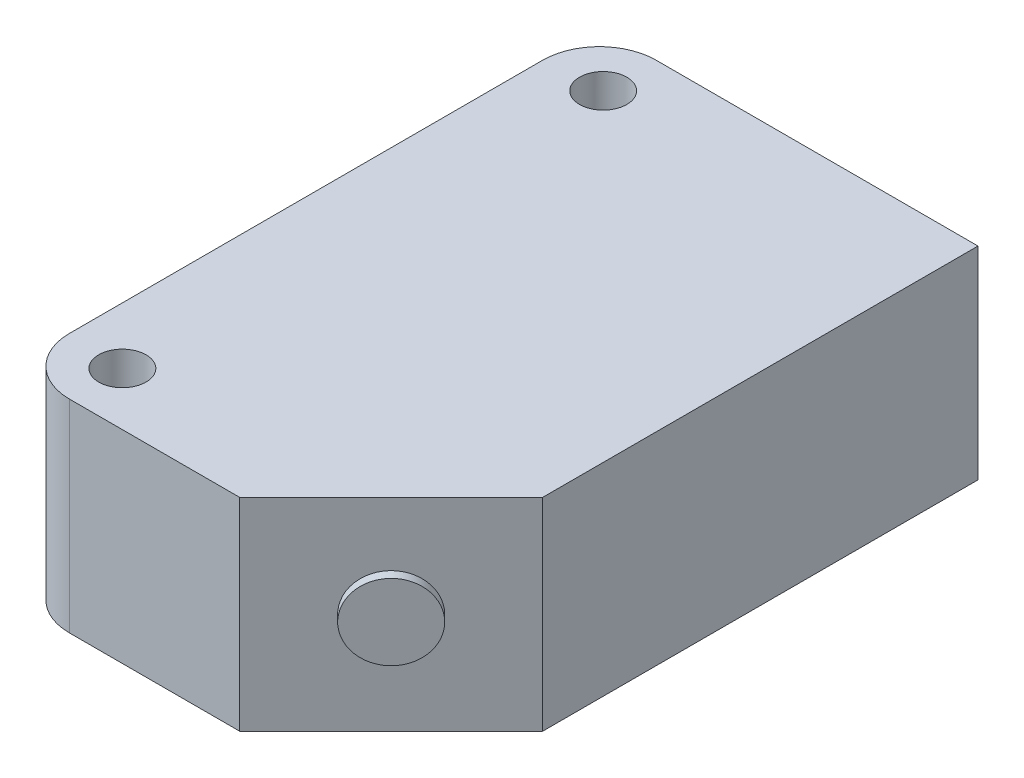
ISO-10303-21;
HEADER;
FILE_DESCRIPTION(('STEP AP214'),'2;1');
FILE_NAME('part.step','',(''),(''),'','','');
FILE_SCHEMA(('AUTOMOTIVE_DESIGN { 1 0 10303 214 1 1 1 1 }'));
ENDSEC;
DATA;
#1=APPLICATION_CONTEXT('core data for automotive mechanical design processes');
#2=APPLICATION_PROTOCOL_DEFINITION('international standard','automotive_design',2000,#1);
#3=PRODUCT_CONTEXT('',#1,'mechanical');
#4=PRODUCT('Part','Part','',(#3));
#5=PRODUCT_RELATED_PRODUCT_CATEGORY('part','',(#4));
#6=PRODUCT_DEFINITION_FORMATION('','',#4);
#7=PRODUCT_DEFINITION_CONTEXT('part definition',#1,'design');
#8=PRODUCT_DEFINITION('design','',#6,#7);
#9=PRODUCT_DEFINITION_SHAPE('','',#8);
#10=(LENGTH_UNIT() NAMED_UNIT(*) SI_UNIT(.MILLI.,.METRE.));
#11=(NAMED_UNIT(*) PLANE_ANGLE_UNIT() SI_UNIT($,.RADIAN.));
#12=(NAMED_UNIT(*) SI_UNIT($,.STERADIAN.) SOLID_ANGLE_UNIT());
#13=UNCERTAINTY_MEASURE_WITH_UNIT(LENGTH_MEASURE(1.E-05),#10,'distance_accuracy_value','');
#14=(GEOMETRIC_REPRESENTATION_CONTEXT(3) GLOBAL_UNCERTAINTY_ASSIGNED_CONTEXT((#13)) GLOBAL_UNIT_ASSIGNED_CONTEXT((#10,
#11,#12)) REPRESENTATION_CONTEXT('',''));
#15=CARTESIAN_POINT('',(0.,0.,0.));
#16=DIRECTION('',(0.,0.,1.));
#17=DIRECTION('',(1.,0.,0.));
#18=AXIS2_PLACEMENT_3D('',#15,#16,#17);
#19=CARTESIAN_POINT('',(-10.,10.7,-15.5));
#20=DIRECTION('',(1.,0.,0.));
#21=DIRECTION('',(0.,0.,-1.));
#22=AXIS2_PLACEMENT_3D('',#19,#20,#21);
#23=PLANE('',#22);
#24=DIRECTION('',(0.,0.,1.));
#25=VECTOR('',#24,1.);
#26=CARTESIAN_POINT('',(-10.,0.,-15.5));
#27=LINE('',#26,#25);
#28=CARTESIAN_POINT('',(-10.,0.,-12.5));
#29=VERTEX_POINT('',#28);
#30=CARTESIAN_POINT('',(-10.,0.,12.5));
#31=VERTEX_POINT('',#30);
#32=EDGE_CURVE('E122',#29,#31,#27,.T.);
#33=ORIENTED_EDGE('',*,*,#32,.T.);
#34=DIRECTION('',(0.,-1.,0.));
#35=VECTOR('',#34,1.);
#36=CARTESIAN_POINT('',(-10.,10.7,12.5));
#37=LINE('',#36,#35);
#38=CARTESIAN_POINT('',(-10.,10.7,12.5));
#39=VERTEX_POINT('',#38);
#40=EDGE_CURVE('E59',#31,#39,#37,.F.);
#41=ORIENTED_EDGE('',*,*,#40,.T.);
#42=DIRECTION('',(0.,0.,1.));
#43=VECTOR('',#42,1.);
#44=CARTESIAN_POINT('',(-10.,10.7,-15.5));
#45=LINE('',#44,#43);
#46=CARTESIAN_POINT('',(-10.,10.7,-12.5));
#47=VERTEX_POINT('',#46);
#48=EDGE_CURVE('E129',#47,#39,#45,.T.);
#49=ORIENTED_EDGE('',*,*,#48,.F.);
#50=DIRECTION('',(0.,-1.,0.));
#51=VECTOR('',#50,1.);
#52=CARTESIAN_POINT('',(-10.,10.7,-12.5));
#53=LINE('',#52,#51);
#54=EDGE_CURVE('E153',#47,#29,#53,.T.);
#55=ORIENTED_EDGE('',*,*,#54,.T.);
#56=EDGE_LOOP('',(#33,#41,#49,#55));
#57=FACE_BOUND('',#56,.T.);
#58=ADVANCED_FACE('F38',(#57),#23,.F.);
#59=CARTESIAN_POINT('',(10.,10.7,15.5));
#60=DIRECTION('',(0.,0.,-1.));
#61=DIRECTION('',(-1.,0.,0.));
#62=AXIS2_PLACEMENT_3D('',#59,#60,#61);
#63=PLANE('',#62);
#64=DIRECTION('',(1.,0.,0.));
#65=VECTOR('',#64,1.);
#66=CARTESIAN_POINT('',(10.,10.7,15.5));
#67=LINE('',#66,#65);
#68=CARTESIAN_POINT('',(-7.,10.7,15.5));
#69=VERTEX_POINT('',#68);
#70=CARTESIAN_POINT('',(1.99999999999998,10.7,15.5));
#71=VERTEX_POINT('',#70);
#72=EDGE_CURVE('E108',#69,#71,#67,.T.);
#73=ORIENTED_EDGE('',*,*,#72,.F.);
#74=DIRECTION('',(0.,-1.,0.));
#75=VECTOR('',#74,1.);
#76=CARTESIAN_POINT('',(-7.,10.7,15.5));
#77=LINE('',#76,#75);
#78=CARTESIAN_POINT('',(-7.,0.,15.5));
#79=VERTEX_POINT('',#78);
#80=EDGE_CURVE('E146',#69,#79,#77,.T.);
#81=ORIENTED_EDGE('',*,*,#80,.T.);
#82=DIRECTION('',(1.,0.,0.));
#83=VECTOR('',#82,1.);
#84=CARTESIAN_POINT('',(10.,0.,15.5));
#85=LINE('',#84,#83);
#86=CARTESIAN_POINT('',(1.99999999999998,0.,15.5));
#87=VERTEX_POINT('',#86);
#88=EDGE_CURVE('E124',#79,#87,#85,.T.);
#89=ORIENTED_EDGE('',*,*,#88,.T.);
#90=DIRECTION('',(0.,1.,0.));
#91=VECTOR('',#90,1.);
#92=CARTESIAN_POINT('',(1.99999999999998,10.7,15.5));
#93=LINE('',#92,#91);
#94=EDGE_CURVE('E141',#87,#71,#93,.T.);
#95=ORIENTED_EDGE('',*,*,#94,.T.);
#96=EDGE_LOOP('',(#73,#81,#89,#95));
#97=FACE_BOUND('',#96,.T.);
#98=ADVANCED_FACE('F163',(#97),#63,.F.);
#99=CARTESIAN_POINT('',(9.99999999999999,10.7,-15.5));
#100=DIRECTION('',(-1.,0.,0.));
#101=DIRECTION('',(0.,0.,1.));
#102=AXIS2_PLACEMENT_3D('',#99,#100,#101);
#103=PLANE('',#102);
#104=DIRECTION('',(0.,0.,-1.));
#105=VECTOR('',#104,1.);
#106=CARTESIAN_POINT('',(9.99999999999999,10.7,-15.5));
#107=LINE('',#106,#105);
#108=CARTESIAN_POINT('',(10.,10.7,7.5));
#109=VERTEX_POINT('',#108);
#110=CARTESIAN_POINT('',(9.99999999999999,10.7,-15.5));
#111=VERTEX_POINT('',#110);
#112=EDGE_CURVE('E98',#109,#111,#107,.T.);
#113=ORIENTED_EDGE('',*,*,#112,.F.);
#114=DIRECTION('',(0.,-1.,0.));
#115=VECTOR('',#114,1.);
#116=CARTESIAN_POINT('',(10.,10.7,7.5));
#117=LINE('',#116,#115);
#118=CARTESIAN_POINT('',(10.,0.,7.5));
#119=VERTEX_POINT('',#118);
#120=EDGE_CURVE('E116',#109,#119,#117,.T.);
#121=ORIENTED_EDGE('',*,*,#120,.T.);
#122=DIRECTION('',(0.,0.,-1.));
#123=VECTOR('',#122,1.);
#124=CARTESIAN_POINT('',(9.99999999999999,0.,-15.5));
#125=LINE('',#124,#123);
#126=CARTESIAN_POINT('',(9.99999999999999,0.,-15.5));
#127=VERTEX_POINT('',#126);
#128=EDGE_CURVE('E114',#119,#127,#125,.T.);
#129=ORIENTED_EDGE('',*,*,#128,.T.);
#130=DIRECTION('',(0.,-1.,0.));
#131=VECTOR('',#130,1.);
#132=CARTESIAN_POINT('',(9.99999999999999,10.7,-15.5));
#133=LINE('',#132,#131);
#134=EDGE_CURVE('E111',#111,#127,#133,.T.);
#135=ORIENTED_EDGE('',*,*,#134,.F.);
#136=EDGE_LOOP('',(#113,#121,#129,#135));
#137=FACE_BOUND('',#136,.T.);
#138=ADVANCED_FACE('F112',(#137),#103,.F.);
#139=CARTESIAN_POINT('',(9.99999999999999,10.7,-15.5));
#140=DIRECTION('',(0.,0.,1.));
#141=DIRECTION('',(1.,0.,0.));
#142=AXIS2_PLACEMENT_3D('',#139,#140,#141);
#143=PLANE('',#142);
#144=DIRECTION('',(-1.,0.,0.));
#145=VECTOR('',#144,1.);
#146=CARTESIAN_POINT('',(9.99999999999999,0.,-15.5));
#147=LINE('',#146,#145);
#148=CARTESIAN_POINT('',(-7.00000000000001,0.,-15.5));
#149=VERTEX_POINT('',#148);
#150=EDGE_CURVE('E128',#127,#149,#147,.T.);
#151=ORIENTED_EDGE('',*,*,#150,.T.);
#152=DIRECTION('',(0.,-1.,0.));
#153=VECTOR('',#152,1.);
#154=CARTESIAN_POINT('',(-7.00000000000001,10.7,-15.5));
#155=LINE('',#154,#153);
#156=CARTESIAN_POINT('',(-7.00000000000001,10.7,-15.5));
#157=VERTEX_POINT('',#156);
#158=EDGE_CURVE('E11',#149,#157,#155,.F.);
#159=ORIENTED_EDGE('',*,*,#158,.T.);
#160=DIRECTION('',(-1.,0.,0.));
#161=VECTOR('',#160,1.);
#162=CARTESIAN_POINT('',(9.99999999999999,10.7,-15.5));
#163=LINE('',#162,#161);
#164=EDGE_CURVE('E101',#111,#157,#163,.T.);
#165=ORIENTED_EDGE('',*,*,#164,.F.);
#166=ORIENTED_EDGE('',*,*,#134,.T.);
#167=EDGE_LOOP('',(#151,#159,#165,#166));
#168=FACE_BOUND('',#167,.T.);
#169=ADVANCED_FACE('F118',(#168),#143,.F.);
#170=CARTESIAN_POINT('',(0.,10.7,0.));
#171=DIRECTION('',(0.,-1.,0.));
#172=DIRECTION('',(0.,0.,-1.));
#173=AXIS2_PLACEMENT_3D('',#170,#171,#172);
#174=PLANE('',#173);
#175=CARTESIAN_POINT('',(-7.,10.7,-12.7));
#176=DIRECTION('',(0.,1.,0.));
#177=DIRECTION('',(0.,0.,1.));
#178=AXIS2_PLACEMENT_3D('',#175,#176,#177);
#179=CIRCLE('',#178,1.25);
#180=CARTESIAN_POINT('',(-7.,10.7,-11.45));
#181=VERTEX_POINT('',#180);
#182=EDGE_CURVE('E134',#181,#181,#179,.T.);
#183=ORIENTED_EDGE('',*,*,#182,.F.);
#184=EDGE_LOOP('',(#183));
#185=FACE_BOUND('',#184,.T.);
#186=CARTESIAN_POINT('',(-7.,10.7,12.7));
#187=DIRECTION('',(0.,1.,0.));
#188=DIRECTION('',(0.,0.,-1.));
#189=AXIS2_PLACEMENT_3D('',#186,#187,#188);
#190=CIRCLE('',#189,1.25);
#191=CARTESIAN_POINT('',(-7.,10.7,11.45));
#192=VERTEX_POINT('',#191);
#193=EDGE_CURVE('E218',#192,#192,#190,.T.);
#194=ORIENTED_EDGE('',*,*,#193,.F.);
#195=EDGE_LOOP('',(#194));
#196=FACE_BOUND('',#195,.T.);
#197=ORIENTED_EDGE('',*,*,#48,.T.);
#198=CARTESIAN_POINT('',(-7.,10.7,12.5));
#199=DIRECTION('',(0.,-1.,0.));
#200=DIRECTION('',(0.,0.,-1.));
#201=AXIS2_PLACEMENT_3D('',#198,#199,#200);
#202=CIRCLE('',#201,3.);
#203=EDGE_CURVE('E46',#39,#69,#202,.F.);
#204=ORIENTED_EDGE('',*,*,#203,.T.);
#205=ORIENTED_EDGE('',*,*,#72,.T.);
#206=DIRECTION('',(-0.707106781186548,0.,0.707106781186547));
#207=VECTOR('',#206,1.);
#208=CARTESIAN_POINT('',(10.,10.7,7.50000000000001));
#209=LINE('',#208,#207);
#210=EDGE_CURVE('E104',#71,#109,#209,.F.);
#211=ORIENTED_EDGE('',*,*,#210,.T.);
#212=ORIENTED_EDGE('',*,*,#112,.T.);
#213=ORIENTED_EDGE('',*,*,#164,.T.);
#214=CARTESIAN_POINT('',(-7.00000000000001,10.7,-12.5));
#215=DIRECTION('',(0.,-1.,0.));
#216=DIRECTION('',(0.,0.,-1.));
#217=AXIS2_PLACEMENT_3D('',#214,#215,#216);
#218=CIRCLE('',#217,3.);
#219=EDGE_CURVE('E157',#157,#47,#218,.F.);
#220=ORIENTED_EDGE('',*,*,#219,.T.);
#221=EDGE_LOOP('',(#197,#204,#205,#211,#212,#213,#220));
#222=FACE_BOUND('',#221,.T.);
#223=ADVANCED_FACE('F100',(#185,#196,#222),#174,.F.);
#224=CARTESIAN_POINT('',(0.,0.,0.));
#225=DIRECTION('',(0.,-1.,0.));
#226=DIRECTION('',(0.,0.,-1.));
#227=AXIS2_PLACEMENT_3D('',#224,#225,#226);
#228=PLANE('',#227);
#229=CARTESIAN_POINT('',(-7.,0.,-12.7));
#230=DIRECTION('',(0.,-1.,0.));
#231=DIRECTION('',(0.,0.,-1.));
#232=AXIS2_PLACEMENT_3D('',#229,#230,#231);
#233=CIRCLE('',#232,1.25);
#234=CARTESIAN_POINT('',(-7.,0.,-13.95));
#235=VERTEX_POINT('',#234);
#236=EDGE_CURVE('E125',#235,#235,#233,.T.);
#237=ORIENTED_EDGE('',*,*,#236,.F.);
#238=EDGE_LOOP('',(#237));
#239=FACE_BOUND('',#238,.T.);
#240=CARTESIAN_POINT('',(-7.,0.,12.7));
#241=DIRECTION('',(0.,-1.,0.));
#242=DIRECTION('',(0.,0.,-1.));
#243=AXIS2_PLACEMENT_3D('',#240,#241,#242);
#244=CIRCLE('',#243,1.25);
#245=CARTESIAN_POINT('',(-7.,0.,11.45));
#246=VERTEX_POINT('',#245);
#247=EDGE_CURVE('E131',#246,#246,#244,.T.);
#248=ORIENTED_EDGE('',*,*,#247,.F.);
#249=EDGE_LOOP('',(#248));
#250=FACE_BOUND('',#249,.T.);
#251=ORIENTED_EDGE('',*,*,#88,.F.);
#252=CARTESIAN_POINT('',(-7.,0.,12.5));
#253=DIRECTION('',(0.,-1.,0.));
#254=DIRECTION('',(0.,0.,-1.));
#255=AXIS2_PLACEMENT_3D('',#252,#253,#254);
#256=CIRCLE('',#255,3.);
#257=EDGE_CURVE('E151',#79,#31,#256,.T.);
#258=ORIENTED_EDGE('',*,*,#257,.T.);
#259=ORIENTED_EDGE('',*,*,#32,.F.);
#260=CARTESIAN_POINT('',(-7.00000000000001,0.,-12.5));
#261=DIRECTION('',(0.,-1.,0.));
#262=DIRECTION('',(0.,0.,-1.));
#263=AXIS2_PLACEMENT_3D('',#260,#261,#262);
#264=CIRCLE('',#263,3.);
#265=EDGE_CURVE('E149',#29,#149,#264,.T.);
#266=ORIENTED_EDGE('',*,*,#265,.T.);
#267=ORIENTED_EDGE('',*,*,#150,.F.);
#268=ORIENTED_EDGE('',*,*,#128,.F.);
#269=DIRECTION('',(0.707106781186548,0.,-0.707106781186547));
#270=VECTOR('',#269,1.);
#271=CARTESIAN_POINT('',(8.74999999999999,0.,8.75000000000001));
#272=LINE('',#271,#270);
#273=EDGE_CURVE('E138',#119,#87,#272,.F.);
#274=ORIENTED_EDGE('',*,*,#273,.T.);
#275=EDGE_LOOP('',(#251,#258,#259,#266,#267,#268,#274));
#276=FACE_BOUND('',#275,.T.);
#277=ADVANCED_FACE('F169',(#239,#250,#276),#228,.T.);
#278=CARTESIAN_POINT('',(-7.,-30.,12.7));
#279=DIRECTION('',(0.,1.,0.));
#280=DIRECTION('',(0.,0.,1.));
#281=AXIS2_PLACEMENT_3D('',#278,#279,#280);
#282=CYLINDRICAL_SURFACE('',#281,1.25);
#283=ORIENTED_EDGE('',*,*,#247,.T.);
#284=EDGE_LOOP('',(#283));
#285=FACE_BOUND('',#284,.T.);
#286=ORIENTED_EDGE('',*,*,#193,.T.);
#287=EDGE_LOOP('',(#286));
#288=FACE_BOUND('',#287,.T.);
#289=ADVANCED_FACE('F186',(#285,#288),#282,.F.);
#290=CARTESIAN_POINT('',(-7.,-30.,-12.7));
#291=DIRECTION('',(0.,1.,0.));
#292=DIRECTION('',(0.,0.,1.));
#293=AXIS2_PLACEMENT_3D('',#290,#291,#292);
#294=CYLINDRICAL_SURFACE('',#293,1.25);
#295=ORIENTED_EDGE('',*,*,#236,.T.);
#296=EDGE_LOOP('',(#295));
#297=FACE_BOUND('',#296,.T.);
#298=ORIENTED_EDGE('',*,*,#182,.T.);
#299=EDGE_LOOP('',(#298));
#300=FACE_BOUND('',#299,.T.);
#301=ADVANCED_FACE('F176',(#297,#300),#294,.F.);
#302=CARTESIAN_POINT('',(10.,10.7,7.50000000000001));
#303=DIRECTION('',(-0.707106781186546,0.,-0.707106781186548));
#304=DIRECTION('',(0.,-1.,0.));
#305=AXIS2_PLACEMENT_3D('',#302,#303,#304);
#306=PLANE('',#305);
#307=CARTESIAN_POINT('',(5.99999999999999,5.35,11.5));
#308=DIRECTION('',(0.707106781186547,0.,0.707106781186548));
#309=DIRECTION('',(0.707106781186548,0.,-0.707106781186547));
#310=AXIS2_PLACEMENT_3D('',#307,#308,#309);
#311=CIRCLE('',#310,2.);
#312=CARTESIAN_POINT('',(7.41421356237309,5.35,10.0857864376269));
#313=VERTEX_POINT('',#312);
#314=EDGE_CURVE('E145',#313,#313,#311,.T.);
#315=ORIENTED_EDGE('',*,*,#314,.F.);
#316=EDGE_LOOP('',(#315));
#317=FACE_BOUND('',#316,.T.);
#318=ORIENTED_EDGE('',*,*,#210,.F.);
#319=ORIENTED_EDGE('',*,*,#94,.F.);
#320=ORIENTED_EDGE('',*,*,#273,.F.);
#321=ORIENTED_EDGE('',*,*,#120,.F.);
#322=EDGE_LOOP('',(#318,#319,#320,#321));
#323=FACE_BOUND('',#322,.T.);
#324=ADVANCED_FACE('F173',(#317,#323),#306,.F.);
#325=CARTESIAN_POINT('',(6.35355339059326,5.35,11.8535533905933));
#326=DIRECTION('',(-0.707106781186547,0.,-0.707106781186548));
#327=DIRECTION('',(-0.707106781186548,0.,0.707106781186547));
#328=AXIS2_PLACEMENT_3D('',#325,#326,#327);
#329=CYLINDRICAL_SURFACE('',#328,2.);
#330=CARTESIAN_POINT('',(6.35355339059326,5.35,11.8535533905933));
#331=DIRECTION('',(0.707106781186547,0.,0.707106781186548));
#332=DIRECTION('',(0.707106781186548,0.,-0.707106781186547));
#333=AXIS2_PLACEMENT_3D('',#330,#331,#332);
#334=CIRCLE('',#333,2.);
#335=CARTESIAN_POINT('',(7.76776695296636,5.35,10.4393398282202));
#336=VERTEX_POINT('',#335);
#337=EDGE_CURVE('E217',#336,#336,#334,.T.);
#338=ORIENTED_EDGE('',*,*,#337,.F.);
#339=EDGE_LOOP('',(#338));
#340=FACE_BOUND('',#339,.T.);
#341=ORIENTED_EDGE('',*,*,#314,.T.);
#342=EDGE_LOOP('',(#341));
#343=FACE_BOUND('',#342,.T.);
#344=ADVANCED_FACE('F175',(#340,#343),#329,.T.);
#345=CARTESIAN_POINT('',(6.35355339059326,5.35,11.8535533905933));
#346=DIRECTION('',(0.707106781186547,0.,0.707106781186548));
#347=DIRECTION('',(0.707106781186548,0.,-0.707106781186547));
#348=AXIS2_PLACEMENT_3D('',#345,#346,#347);
#349=PLANE('',#348);
#350=ORIENTED_EDGE('',*,*,#337,.T.);
#351=EDGE_LOOP('',(#350));
#352=FACE_BOUND('',#351,.T.);
#353=ADVANCED_FACE('F183',(#352),#349,.T.);
#354=CARTESIAN_POINT('',(-7.,10.7,12.5));
#355=DIRECTION('',(0.,-1.,0.));
#356=DIRECTION('',(0.,0.,-1.));
#357=AXIS2_PLACEMENT_3D('',#354,#355,#356);
#358=CYLINDRICAL_SURFACE('',#357,3.);
#359=ORIENTED_EDGE('',*,*,#203,.F.);
#360=ORIENTED_EDGE('',*,*,#40,.F.);
#361=ORIENTED_EDGE('',*,*,#257,.F.);
#362=ORIENTED_EDGE('',*,*,#80,.F.);
#363=EDGE_LOOP('',(#359,#360,#361,#362));
#364=FACE_BOUND('',#363,.T.);
#365=ADVANCED_FACE('F166',(#364),#358,.T.);
#366=CARTESIAN_POINT('',(-7.00000000000001,10.7,-12.5));
#367=DIRECTION('',(0.,-1.,0.));
#368=DIRECTION('',(0.,0.,-1.));
#369=AXIS2_PLACEMENT_3D('',#366,#367,#368);
#370=CYLINDRICAL_SURFACE('',#369,3.);
#371=ORIENTED_EDGE('',*,*,#219,.F.);
#372=ORIENTED_EDGE('',*,*,#158,.F.);
#373=ORIENTED_EDGE('',*,*,#265,.F.);
#374=ORIENTED_EDGE('',*,*,#54,.F.);
#375=EDGE_LOOP('',(#371,#372,#373,#374));
#376=FACE_BOUND('',#375,.T.);
#377=ADVANCED_FACE('F40',(#376),#370,.T.);
#378=CLOSED_SHELL('',(#58,#98,#138,#169,#223,#277,#289,#301,#324,#344,#353,#365,#377));
#379=MANIFOLD_SOLID_BREP('B2',#378);
#380=ADVANCED_BREP_SHAPE_REPRESENTATION('',(#18,#379),#14);
#381=SHAPE_DEFINITION_REPRESENTATION(#9,#380);
ENDSEC;
END-ISO-10303-21;
